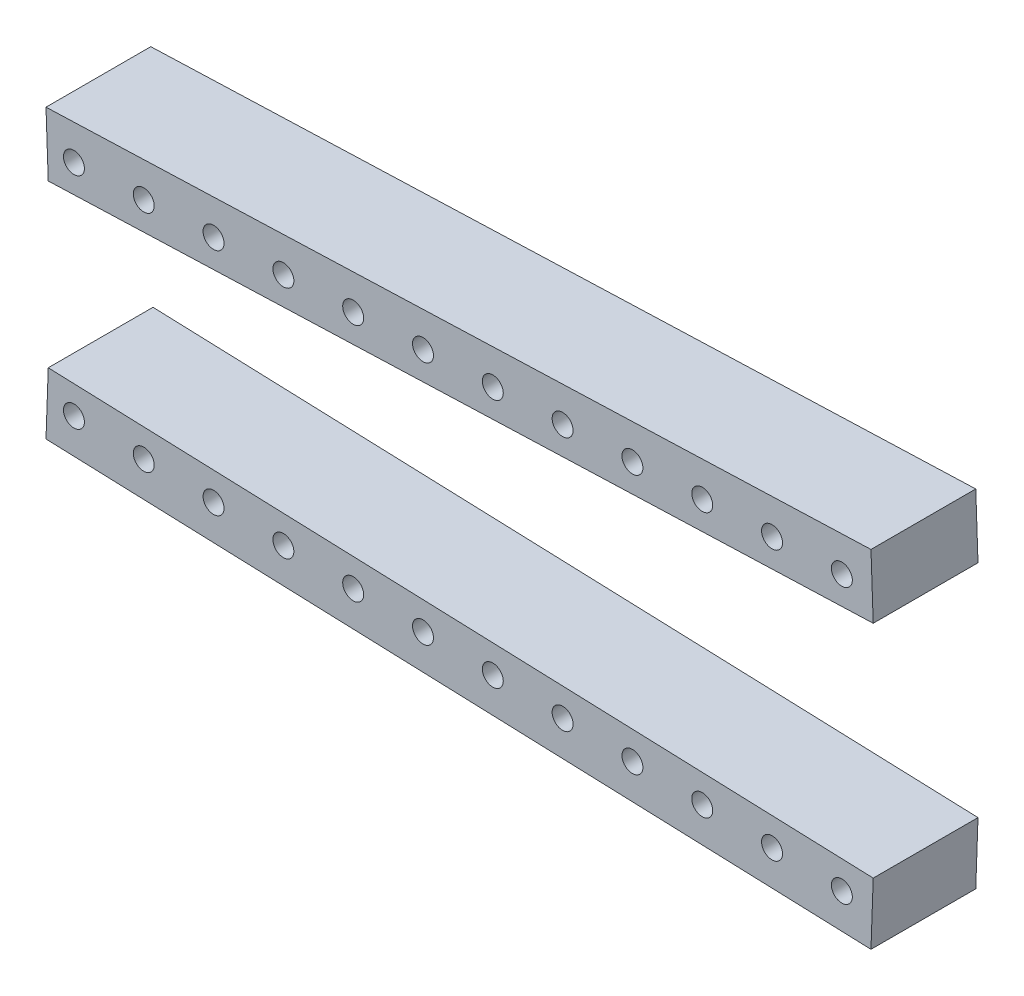
ISO-10303-21;
HEADER;
FILE_DESCRIPTION(('STEP AP214'),'2;1');
FILE_NAME('part.step','',(''),(''),'','','');
FILE_SCHEMA(('AUTOMOTIVE_DESIGN { 1 0 10303 214 1 1 1 1 }'));
ENDSEC;
DATA;
#1=APPLICATION_CONTEXT('core data for automotive mechanical design processes');
#2=APPLICATION_PROTOCOL_DEFINITION('international standard','automotive_design',2000,#1);
#3=PRODUCT_CONTEXT('',#1,'mechanical');
#4=PRODUCT('Part','Part','',(#3));
#5=PRODUCT_RELATED_PRODUCT_CATEGORY('part','',(#4));
#6=PRODUCT_DEFINITION_FORMATION('','',#4);
#7=PRODUCT_DEFINITION_CONTEXT('part definition',#1,'design');
#8=PRODUCT_DEFINITION('design','',#6,#7);
#9=PRODUCT_DEFINITION_SHAPE('','',#8);
#10=(LENGTH_UNIT() NAMED_UNIT(*) SI_UNIT(.MILLI.,.METRE.));
#11=(NAMED_UNIT(*) PLANE_ANGLE_UNIT() SI_UNIT($,.RADIAN.));
#12=(NAMED_UNIT(*) SI_UNIT($,.STERADIAN.) SOLID_ANGLE_UNIT());
#13=UNCERTAINTY_MEASURE_WITH_UNIT(LENGTH_MEASURE(1.E-05),#10,'distance_accuracy_value','');
#14=(GEOMETRIC_REPRESENTATION_CONTEXT(3) GLOBAL_UNCERTAINTY_ASSIGNED_CONTEXT((#13)) GLOBAL_UNIT_ASSIGNED_CONTEXT((#10,
#11,#12)) REPRESENTATION_CONTEXT('',''));
#15=CARTESIAN_POINT('',(0.,0.,0.));
#16=DIRECTION('',(0.,0.,1.));
#17=DIRECTION('',(1.,0.,0.));
#18=AXIS2_PLACEMENT_3D('',#15,#16,#17);
#19=CARTESIAN_POINT('',(-0.713375796178345,-19.9745222929936,-5.));
#20=DIRECTION('',(0.0356915305124125,0.99936285434755,0.));
#21=DIRECTION('',(-0.99936285434755,0.0356915305124125,0.));
#22=AXIS2_PLACEMENT_3D('',#19,#20,#21);
#23=PLANE('',#22);
#24=DIRECTION('',(0.,0.,1.));
#25=VECTOR('',#24,1.);
#26=CARTESIAN_POINT('',(15.9876544347127,-20.5709876583826,0.));
#27=LINE('',#26,#25);
#28=CARTESIAN_POINT('',(15.9876544347127,-20.5709876583826,-10.));
#29=VERTEX_POINT('',#28);
#30=CARTESIAN_POINT('',(15.9876544347127,-20.5709876583826,5.));
#31=VERTEX_POINT('',#30);
#32=EDGE_CURVE('E172',#29,#31,#27,.T.);
#33=ORIENTED_EDGE('',*,*,#32,.F.);
#34=DIRECTION('',(-0.99936285434755,0.0356915305124126,0.));
#35=VECTOR('',#34,1.);
#36=CARTESIAN_POINT('',(134.085070339558,-24.7887525121271,-10.));
#37=LINE('',#36,#35);
#38=CARTESIAN_POINT('',(134.085070339558,-24.7887525121271,-10.));
#39=VERTEX_POINT('',#38);
#40=EDGE_CURVE('E182',#39,#29,#37,.T.);
#41=ORIENTED_EDGE('',*,*,#40,.F.);
#42=DIRECTION('',(0.,0.,1.));
#43=VECTOR('',#42,1.);
#44=CARTESIAN_POINT('',(134.085070339558,-24.7887525121271,0.));
#45=LINE('',#44,#43);
#46=CARTESIAN_POINT('',(134.085070339558,-24.7887525121271,5.));
#47=VERTEX_POINT('',#46);
#48=EDGE_CURVE('E186',#39,#47,#45,.T.);
#49=ORIENTED_EDGE('',*,*,#48,.T.);
#50=DIRECTION('',(-0.99936285434755,0.0356915305124125,0.));
#51=VECTOR('',#50,1.);
#52=CARTESIAN_POINT('',(-0.713375796178345,-19.9745222929936,5.));
#53=LINE('',#52,#51);
#54=EDGE_CURVE('E189',#47,#31,#53,.T.);
#55=ORIENTED_EDGE('',*,*,#54,.T.);
#56=EDGE_LOOP('',(#33,#41,#49,#55));
#57=FACE_BOUND('',#56,.T.);
#58=ADVANCED_FACE('F124',(#57),#23,.F.);
#59=CARTESIAN_POINT('',(0.,0.,5.));
#60=DIRECTION('',(0.,0.,1.));
#61=DIRECTION('',(1.,0.,0.));
#62=AXIS2_PLACEMENT_3D('',#59,#60,#61);
#63=PLANE('',#62);
#64=DIRECTION('',(-0.0356915305124131,-0.99936285434755,0.));
#65=VECTOR('',#64,1.);
#66=CARTESIAN_POINT('',(134.798446135736,-4.81423021913351,5.));
#67=LINE('',#66,#65);
#68=CARTESIAN_POINT('',(134.406294114169,-15.7944868229991,5.));
#69=VERTEX_POINT('',#68);
#70=EDGE_CURVE('E128',#69,#47,#67,.T.);
#71=ORIENTED_EDGE('',*,*,#70,.F.);
#72=DIRECTION('',(-0.99936285434755,0.0356915305124125,0.));
#73=VECTOR('',#72,1.);
#74=CARTESIAN_POINT('',(-0.392152021566632,-10.9802566038657,5.));
#75=LINE('',#74,#73);
#76=CARTESIAN_POINT('',(16.3088782093244,-11.5767219692547,5.));
#77=VERTEX_POINT('',#76);
#78=EDGE_CURVE('E194',#69,#77,#75,.T.);
#79=ORIENTED_EDGE('',*,*,#78,.T.);
#80=DIRECTION('',(-0.0356915305124146,-0.99936285434755,0.));
#81=VECTOR('',#80,1.);
#82=CARTESIAN_POINT('',(16.7010302308911,-0.596465365389002,5.));
#83=LINE('',#82,#81);
#84=EDGE_CURVE('E167',#77,#31,#83,.T.);
#85=ORIENTED_EDGE('',*,*,#84,.T.);
#86=ORIENTED_EDGE('',*,*,#54,.F.);
#87=EDGE_LOOP('',(#71,#79,#85,#86));
#88=FACE_BOUND('',#87,.T.);
#89=CARTESIAN_POINT('',(119.923542521706,-19.2829836614895,5.));
#90=DIRECTION('',(0.,0.,1.));
#91=DIRECTION('',(1.,0.,0.));
#92=AXIS2_PLACEMENT_3D('',#89,#90,#91);
#93=CIRCLE('',#92,1.50000000000001);
#94=CARTESIAN_POINT('',(121.423542521706,-19.2829836614895,5.));
#95=VERTEX_POINT('',#94);
#96=EDGE_CURVE('E173',#95,#95,#93,.T.);
#97=ORIENTED_EDGE('',*,*,#96,.F.);
#98=EDGE_LOOP('',(#97));
#99=FACE_BOUND('',#98,.T.);
#100=CARTESIAN_POINT('',(109.92991397823,-18.9260683563654,5.));
#101=DIRECTION('',(0.,0.,1.));
#102=DIRECTION('',(1.,0.,0.));
#103=AXIS2_PLACEMENT_3D('',#100,#101,#102);
#104=CIRCLE('',#103,1.50000000000001);
#105=CARTESIAN_POINT('',(111.42991397823,-18.9260683563654,5.));
#106=VERTEX_POINT('',#105);
#107=EDGE_CURVE('E222',#106,#106,#104,.T.);
#108=ORIENTED_EDGE('',*,*,#107,.F.);
#109=EDGE_LOOP('',(#108));
#110=FACE_BOUND('',#109,.T.);
#111=CARTESIAN_POINT('',(99.9362854347549,-18.5691530512413,5.));
#112=DIRECTION('',(0.,0.,1.));
#113=DIRECTION('',(1.,0.,0.));
#114=AXIS2_PLACEMENT_3D('',#111,#112,#113);
#115=CIRCLE('',#114,1.50000000000001);
#116=CARTESIAN_POINT('',(101.436285434755,-18.5691530512413,5.));
#117=VERTEX_POINT('',#116);
#118=EDGE_CURVE('E225',#117,#117,#115,.T.);
#119=ORIENTED_EDGE('',*,*,#118,.F.);
#120=EDGE_LOOP('',(#119));
#121=FACE_BOUND('',#120,.T.);
#122=CARTESIAN_POINT('',(79.9490283478039,-17.855322440993,5.));
#123=DIRECTION('',(0.,0.,1.));
#124=DIRECTION('',(1.,0.,0.));
#125=AXIS2_PLACEMENT_3D('',#122,#123,#124);
#126=CIRCLE('',#125,1.50000000000001);
#127=CARTESIAN_POINT('',(81.4490283478039,-17.855322440993,5.));
#128=VERTEX_POINT('',#127);
#129=EDGE_CURVE('E207',#128,#128,#126,.T.);
#130=ORIENTED_EDGE('',*,*,#129,.F.);
#131=EDGE_LOOP('',(#130));
#132=FACE_BOUND('',#131,.T.);
#133=CARTESIAN_POINT('',(39.9745141739019,-16.4276612204965,5.));
#134=DIRECTION('',(0.,0.,1.));
#135=DIRECTION('',(1.,0.,0.));
#136=AXIS2_PLACEMENT_3D('',#133,#134,#135);
#137=CIRCLE('',#136,1.5);
#138=CARTESIAN_POINT('',(41.4745141739019,-16.4276612204965,5.));
#139=VERTEX_POINT('',#138);
#140=EDGE_CURVE('E204',#139,#139,#137,.T.);
#141=ORIENTED_EDGE('',*,*,#140,.F.);
#142=EDGE_LOOP('',(#141));
#143=FACE_BOUND('',#142,.T.);
#144=CARTESIAN_POINT('',(29.9808856304264,-16.0707459153724,5.));
#145=DIRECTION('',(0.,0.,1.));
#146=DIRECTION('',(1.,0.,0.));
#147=AXIS2_PLACEMENT_3D('',#144,#145,#146);
#148=CIRCLE('',#147,1.5);
#149=CARTESIAN_POINT('',(31.4808856304264,-16.0707459153724,5.));
#150=VERTEX_POINT('',#149);
#151=EDGE_CURVE('E198',#150,#150,#148,.T.);
#152=ORIENTED_EDGE('',*,*,#151,.F.);
#153=EDGE_LOOP('',(#152));
#154=FACE_BOUND('',#153,.T.);
#155=CARTESIAN_POINT('',(19.9872570869509,-15.7138306102482,5.));
#156=DIRECTION('',(0.,0.,1.));
#157=DIRECTION('',(1.,0.,0.));
#158=AXIS2_PLACEMENT_3D('',#155,#156,#157);
#159=CIRCLE('',#158,1.5);
#160=CARTESIAN_POINT('',(21.4872570869509,-15.7138306102482,5.));
#161=VERTEX_POINT('',#160);
#162=EDGE_CURVE('E195',#161,#161,#159,.T.);
#163=ORIENTED_EDGE('',*,*,#162,.F.);
#164=EDGE_LOOP('',(#163));
#165=FACE_BOUND('',#164,.T.);
#166=CARTESIAN_POINT('',(129.917171065181,-19.6398989666136,5.));
#167=DIRECTION('',(0.,0.,1.));
#168=DIRECTION('',(1.,0.,0.));
#169=AXIS2_PLACEMENT_3D('',#166,#167,#168);
#170=CIRCLE('',#169,1.5);
#171=CARTESIAN_POINT('',(131.417171065181,-19.6398989666136,5.));
#172=VERTEX_POINT('',#171);
#173=EDGE_CURVE('E200',#172,#172,#170,.T.);
#174=ORIENTED_EDGE('',*,*,#173,.F.);
#175=EDGE_LOOP('',(#174));
#176=FACE_BOUND('',#175,.T.);
#177=CARTESIAN_POINT('',(49.9681427173774,-16.7845765256206,5.));
#178=DIRECTION('',(0.,0.,1.));
#179=DIRECTION('',(1.,0.,0.));
#180=AXIS2_PLACEMENT_3D('',#177,#178,#179);
#181=CIRCLE('',#180,1.5);
#182=CARTESIAN_POINT('',(51.4681427173774,-16.7845765256206,5.));
#183=VERTEX_POINT('',#182);
#184=EDGE_CURVE('E199',#183,#183,#181,.T.);
#185=ORIENTED_EDGE('',*,*,#184,.F.);
#186=EDGE_LOOP('',(#185));
#187=FACE_BOUND('',#186,.T.);
#188=CARTESIAN_POINT('',(59.9617712608529,-17.1414918307448,5.));
#189=DIRECTION('',(0.,0.,1.));
#190=DIRECTION('',(1.,0.,0.));
#191=AXIS2_PLACEMENT_3D('',#188,#189,#190);
#192=CIRCLE('',#191,1.5);
#193=CARTESIAN_POINT('',(61.4617712608529,-17.1414918307448,5.));
#194=VERTEX_POINT('',#193);
#195=EDGE_CURVE('E215',#194,#194,#192,.T.);
#196=ORIENTED_EDGE('',*,*,#195,.F.);
#197=EDGE_LOOP('',(#196));
#198=FACE_BOUND('',#197,.T.);
#199=CARTESIAN_POINT('',(69.9553998043284,-17.4984071358689,5.));
#200=DIRECTION('',(0.,0.,1.));
#201=DIRECTION('',(1.,0.,0.));
#202=AXIS2_PLACEMENT_3D('',#199,#200,#201);
#203=CIRCLE('',#202,1.50000000000001);
#204=CARTESIAN_POINT('',(71.4553998043284,-17.4984071358689,5.));
#205=VERTEX_POINT('',#204);
#206=EDGE_CURVE('E212',#205,#205,#203,.T.);
#207=ORIENTED_EDGE('',*,*,#206,.F.);
#208=EDGE_LOOP('',(#207));
#209=FACE_BOUND('',#208,.T.);
#210=CARTESIAN_POINT('',(89.9426568912794,-18.2122377461171,5.));
#211=DIRECTION('',(0.,0.,1.));
#212=DIRECTION('',(1.,0.,0.));
#213=AXIS2_PLACEMENT_3D('',#210,#211,#212);
#214=CIRCLE('',#213,1.50000000000001);
#215=CARTESIAN_POINT('',(91.4426568912794,-18.2122377461171,5.));
#216=VERTEX_POINT('',#215);
#217=EDGE_CURVE('E203',#216,#216,#214,.T.);
#218=ORIENTED_EDGE('',*,*,#217,.F.);
#219=EDGE_LOOP('',(#218));
#220=FACE_BOUND('',#219,.T.);
#221=ADVANCED_FACE('F126',(#88,#99,#110,#121,#132,#143,#154,#165,#176,#187,#198,#209,#220),#63,.T.);
#222=CARTESIAN_POINT('',(129.917171065181,-19.6398989666136,-5.));
#223=DIRECTION('',(0.,0.,1.));
#224=DIRECTION('',(1.,0.,0.));
#225=AXIS2_PLACEMENT_3D('',#222,#223,#224);
#226=CYLINDRICAL_SURFACE('',#225,1.5);
#227=ORIENTED_EDGE('',*,*,#173,.T.);
#228=EDGE_LOOP('',(#227));
#229=FACE_BOUND('',#228,.T.);
#230=CARTESIAN_POINT('',(129.917171065181,-19.6398989666136,-10.));
#231=DIRECTION('',(0.,0.,1.));
#232=DIRECTION('',(1.,0.,0.));
#233=AXIS2_PLACEMENT_3D('',#230,#231,#232);
#234=CIRCLE('',#233,1.5);
#235=CARTESIAN_POINT('',(131.417171065181,-19.6398989666136,-10.));
#236=VERTEX_POINT('',#235);
#237=EDGE_CURVE('E183',#236,#236,#234,.T.);
#238=ORIENTED_EDGE('',*,*,#237,.F.);
#239=EDGE_LOOP('',(#238));
#240=FACE_BOUND('',#239,.T.);
#241=ADVANCED_FACE('F253',(#229,#240),#226,.F.);
#242=CARTESIAN_POINT('',(89.9426568912794,-18.2122377461171,-5.));
#243=DIRECTION('',(0.,0.,1.));
#244=DIRECTION('',(1.,0.,0.));
#245=AXIS2_PLACEMENT_3D('',#242,#243,#244);
#246=CYLINDRICAL_SURFACE('',#245,1.50000000000001);
#247=ORIENTED_EDGE('',*,*,#217,.T.);
#248=EDGE_LOOP('',(#247));
#249=FACE_BOUND('',#248,.T.);
#250=CARTESIAN_POINT('',(89.9426568912794,-18.2122377461171,-10.));
#251=DIRECTION('',(0.,0.,1.));
#252=DIRECTION('',(1.,0.,0.));
#253=AXIS2_PLACEMENT_3D('',#250,#251,#252);
#254=CIRCLE('',#253,1.50000000000001);
#255=CARTESIAN_POINT('',(91.4426568912794,-18.2122377461171,-10.));
#256=VERTEX_POINT('',#255);
#257=EDGE_CURVE('E485',#256,#256,#254,.T.);
#258=ORIENTED_EDGE('',*,*,#257,.F.);
#259=EDGE_LOOP('',(#258));
#260=FACE_BOUND('',#259,.T.);
#261=ADVANCED_FACE('F262',(#249,#260),#246,.F.);
#262=CARTESIAN_POINT('',(69.9553998043284,-17.4984071358689,-5.));
#263=DIRECTION('',(0.,0.,1.));
#264=DIRECTION('',(1.,0.,0.));
#265=AXIS2_PLACEMENT_3D('',#262,#263,#264);
#266=CYLINDRICAL_SURFACE('',#265,1.50000000000001);
#267=ORIENTED_EDGE('',*,*,#206,.T.);
#268=EDGE_LOOP('',(#267));
#269=FACE_BOUND('',#268,.T.);
#270=CARTESIAN_POINT('',(69.9553998043284,-17.4984071358689,-10.));
#271=DIRECTION('',(0.,0.,1.));
#272=DIRECTION('',(1.,0.,0.));
#273=AXIS2_PLACEMENT_3D('',#270,#271,#272);
#274=CIRCLE('',#273,1.50000000000001);
#275=CARTESIAN_POINT('',(71.4553998043284,-17.4984071358689,-10.));
#276=VERTEX_POINT('',#275);
#277=EDGE_CURVE('E486',#276,#276,#274,.T.);
#278=ORIENTED_EDGE('',*,*,#277,.F.);
#279=EDGE_LOOP('',(#278));
#280=FACE_BOUND('',#279,.T.);
#281=ADVANCED_FACE('F274',(#269,#280),#266,.F.);
#282=CARTESIAN_POINT('',(59.9617712608529,-17.1414918307448,-5.));
#283=DIRECTION('',(0.,0.,1.));
#284=DIRECTION('',(1.,0.,0.));
#285=AXIS2_PLACEMENT_3D('',#282,#283,#284);
#286=CYLINDRICAL_SURFACE('',#285,1.5);
#287=ORIENTED_EDGE('',*,*,#195,.T.);
#288=EDGE_LOOP('',(#287));
#289=FACE_BOUND('',#288,.T.);
#290=CARTESIAN_POINT('',(59.9617712608529,-17.1414918307448,-10.));
#291=DIRECTION('',(0.,0.,1.));
#292=DIRECTION('',(1.,0.,0.));
#293=AXIS2_PLACEMENT_3D('',#290,#291,#292);
#294=CIRCLE('',#293,1.5);
#295=CARTESIAN_POINT('',(61.4617712608529,-17.1414918307448,-10.));
#296=VERTEX_POINT('',#295);
#297=EDGE_CURVE('E492',#296,#296,#294,.T.);
#298=ORIENTED_EDGE('',*,*,#297,.F.);
#299=EDGE_LOOP('',(#298));
#300=FACE_BOUND('',#299,.T.);
#301=ADVANCED_FACE('F278',(#289,#300),#286,.F.);
#302=CARTESIAN_POINT('',(49.9681427173774,-16.7845765256206,-5.));
#303=DIRECTION('',(0.,0.,1.));
#304=DIRECTION('',(1.,0.,0.));
#305=AXIS2_PLACEMENT_3D('',#302,#303,#304);
#306=CYLINDRICAL_SURFACE('',#305,1.5);
#307=ORIENTED_EDGE('',*,*,#184,.T.);
#308=EDGE_LOOP('',(#307));
#309=FACE_BOUND('',#308,.T.);
#310=CARTESIAN_POINT('',(49.9681427173774,-16.7845765256206,-10.));
#311=DIRECTION('',(0.,0.,1.));
#312=DIRECTION('',(1.,0.,0.));
#313=AXIS2_PLACEMENT_3D('',#310,#311,#312);
#314=CIRCLE('',#313,1.5);
#315=CARTESIAN_POINT('',(51.4681427173774,-16.7845765256206,-10.));
#316=VERTEX_POINT('',#315);
#317=EDGE_CURVE('E498',#316,#316,#314,.T.);
#318=ORIENTED_EDGE('',*,*,#317,.F.);
#319=EDGE_LOOP('',(#318));
#320=FACE_BOUND('',#319,.T.);
#321=ADVANCED_FACE('F259',(#309,#320),#306,.F.);
#322=CARTESIAN_POINT('',(19.9872570869509,-15.7138306102482,-5.));
#323=DIRECTION('',(0.,0.,1.));
#324=DIRECTION('',(1.,0.,0.));
#325=AXIS2_PLACEMENT_3D('',#322,#323,#324);
#326=CYLINDRICAL_SURFACE('',#325,1.5);
#327=ORIENTED_EDGE('',*,*,#162,.T.);
#328=EDGE_LOOP('',(#327));
#329=FACE_BOUND('',#328,.T.);
#330=CARTESIAN_POINT('',(19.9872570869509,-15.7138306102482,-10.));
#331=DIRECTION('',(0.,0.,1.));
#332=DIRECTION('',(1.,0.,0.));
#333=AXIS2_PLACEMENT_3D('',#330,#331,#332);
#334=CIRCLE('',#333,1.5);
#335=CARTESIAN_POINT('',(21.4872570869509,-15.7138306102482,-10.));
#336=VERTEX_POINT('',#335);
#337=EDGE_CURVE('E507',#336,#336,#334,.T.);
#338=ORIENTED_EDGE('',*,*,#337,.F.);
#339=EDGE_LOOP('',(#338));
#340=FACE_BOUND('',#339,.T.);
#341=ADVANCED_FACE('F255',(#329,#340),#326,.F.);
#342=CARTESIAN_POINT('',(29.9808856304264,-16.0707459153724,-5.));
#343=DIRECTION('',(0.,0.,1.));
#344=DIRECTION('',(1.,0.,0.));
#345=AXIS2_PLACEMENT_3D('',#342,#343,#344);
#346=CYLINDRICAL_SURFACE('',#345,1.5);
#347=ORIENTED_EDGE('',*,*,#151,.T.);
#348=EDGE_LOOP('',(#347));
#349=FACE_BOUND('',#348,.T.);
#350=CARTESIAN_POINT('',(29.9808856304264,-16.0707459153724,-10.));
#351=DIRECTION('',(0.,0.,1.));
#352=DIRECTION('',(1.,0.,0.));
#353=AXIS2_PLACEMENT_3D('',#350,#351,#352);
#354=CIRCLE('',#353,1.5);
#355=CARTESIAN_POINT('',(31.4808856304264,-16.0707459153724,-10.));
#356=VERTEX_POINT('',#355);
#357=EDGE_CURVE('E504',#356,#356,#354,.T.);
#358=ORIENTED_EDGE('',*,*,#357,.F.);
#359=EDGE_LOOP('',(#358));
#360=FACE_BOUND('',#359,.T.);
#361=ADVANCED_FACE('F258',(#349,#360),#346,.F.);
#362=CARTESIAN_POINT('',(39.9745141739019,-16.4276612204965,-5.));
#363=DIRECTION('',(0.,0.,1.));
#364=DIRECTION('',(1.,0.,0.));
#365=AXIS2_PLACEMENT_3D('',#362,#363,#364);
#366=CYLINDRICAL_SURFACE('',#365,1.5);
#367=ORIENTED_EDGE('',*,*,#140,.T.);
#368=EDGE_LOOP('',(#367));
#369=FACE_BOUND('',#368,.T.);
#370=CARTESIAN_POINT('',(39.9745141739019,-16.4276612204965,-10.));
#371=DIRECTION('',(0.,0.,1.));
#372=DIRECTION('',(1.,0.,0.));
#373=AXIS2_PLACEMENT_3D('',#370,#371,#372);
#374=CIRCLE('',#373,1.49999999999999);
#375=CARTESIAN_POINT('',(41.4745141739019,-16.4276612204965,-10.));
#376=VERTEX_POINT('',#375);
#377=EDGE_CURVE('E501',#376,#376,#374,.T.);
#378=ORIENTED_EDGE('',*,*,#377,.F.);
#379=EDGE_LOOP('',(#378));
#380=FACE_BOUND('',#379,.T.);
#381=ADVANCED_FACE('F264',(#369,#380),#366,.F.);
#382=CARTESIAN_POINT('',(79.9490283478039,-17.855322440993,-5.));
#383=DIRECTION('',(0.,0.,1.));
#384=DIRECTION('',(1.,0.,0.));
#385=AXIS2_PLACEMENT_3D('',#382,#383,#384);
#386=CYLINDRICAL_SURFACE('',#385,1.50000000000001);
#387=ORIENTED_EDGE('',*,*,#129,.T.);
#388=EDGE_LOOP('',(#387));
#389=FACE_BOUND('',#388,.T.);
#390=CARTESIAN_POINT('',(79.9490283478039,-17.855322440993,-10.));
#391=DIRECTION('',(0.,0.,1.));
#392=DIRECTION('',(1.,0.,0.));
#393=AXIS2_PLACEMENT_3D('',#390,#391,#392);
#394=CIRCLE('',#393,1.50000000000001);
#395=CARTESIAN_POINT('',(81.4490283478039,-17.855322440993,-10.));
#396=VERTEX_POINT('',#395);
#397=EDGE_CURVE('E483',#396,#396,#394,.T.);
#398=ORIENTED_EDGE('',*,*,#397,.F.);
#399=EDGE_LOOP('',(#398));
#400=FACE_BOUND('',#399,.T.);
#401=ADVANCED_FACE('F267',(#389,#400),#386,.F.);
#402=CARTESIAN_POINT('',(99.9362854347549,-18.5691530512413,-5.));
#403=DIRECTION('',(0.,0.,1.));
#404=DIRECTION('',(1.,0.,0.));
#405=AXIS2_PLACEMENT_3D('',#402,#403,#404);
#406=CYLINDRICAL_SURFACE('',#405,1.50000000000001);
#407=ORIENTED_EDGE('',*,*,#118,.T.);
#408=EDGE_LOOP('',(#407));
#409=FACE_BOUND('',#408,.T.);
#410=CARTESIAN_POINT('',(99.9362854347549,-18.5691530512413,-10.));
#411=DIRECTION('',(0.,0.,1.));
#412=DIRECTION('',(1.,0.,0.));
#413=AXIS2_PLACEMENT_3D('',#410,#411,#412);
#414=CIRCLE('',#413,1.50000000000001);
#415=CARTESIAN_POINT('',(101.436285434755,-18.5691530512413,-10.));
#416=VERTEX_POINT('',#415);
#417=EDGE_CURVE('E489',#416,#416,#414,.T.);
#418=ORIENTED_EDGE('',*,*,#417,.F.);
#419=EDGE_LOOP('',(#418));
#420=FACE_BOUND('',#419,.T.);
#421=ADVANCED_FACE('F293',(#409,#420),#406,.F.);
#422=CARTESIAN_POINT('',(109.92991397823,-18.9260683563654,-5.));
#423=DIRECTION('',(0.,0.,1.));
#424=DIRECTION('',(1.,0.,0.));
#425=AXIS2_PLACEMENT_3D('',#422,#423,#424);
#426=CYLINDRICAL_SURFACE('',#425,1.50000000000001);
#427=ORIENTED_EDGE('',*,*,#107,.T.);
#428=EDGE_LOOP('',(#427));
#429=FACE_BOUND('',#428,.T.);
#430=CARTESIAN_POINT('',(109.92991397823,-18.9260683563654,-10.));
#431=DIRECTION('',(0.,0.,1.));
#432=DIRECTION('',(1.,0.,0.));
#433=AXIS2_PLACEMENT_3D('',#430,#431,#432);
#434=CIRCLE('',#433,1.50000000000001);
#435=CARTESIAN_POINT('',(111.42991397823,-18.9260683563654,-10.));
#436=VERTEX_POINT('',#435);
#437=EDGE_CURVE('E526',#436,#436,#434,.T.);
#438=ORIENTED_EDGE('',*,*,#437,.F.);
#439=EDGE_LOOP('',(#438));
#440=FACE_BOUND('',#439,.T.);
#441=ADVANCED_FACE('F289',(#429,#440),#426,.F.);
#442=CARTESIAN_POINT('',(119.923542521706,-19.2829836614895,-5.));
#443=DIRECTION('',(0.,0.,1.));
#444=DIRECTION('',(1.,0.,0.));
#445=AXIS2_PLACEMENT_3D('',#442,#443,#444);
#446=CYLINDRICAL_SURFACE('',#445,1.50000000000001);
#447=ORIENTED_EDGE('',*,*,#96,.T.);
#448=EDGE_LOOP('',(#447));
#449=FACE_BOUND('',#448,.T.);
#450=CARTESIAN_POINT('',(119.923542521706,-19.2829836614895,-10.));
#451=DIRECTION('',(0.,0.,1.));
#452=DIRECTION('',(1.,0.,0.));
#453=AXIS2_PLACEMENT_3D('',#450,#451,#452);
#454=CIRCLE('',#453,1.50000000000001);
#455=CARTESIAN_POINT('',(121.423542521706,-19.2829836614895,-10.));
#456=VERTEX_POINT('',#455);
#457=EDGE_CURVE('E529',#456,#456,#454,.T.);
#458=ORIENTED_EDGE('',*,*,#457,.F.);
#459=EDGE_LOOP('',(#458));
#460=FACE_BOUND('',#459,.T.);
#461=ADVANCED_FACE('F286',(#449,#460),#446,.F.);
#462=CARTESIAN_POINT('',(-0.392152021566632,-10.9802566038657,0.));
#463=DIRECTION('',(0.0356915305124125,0.99936285434755,0.));
#464=DIRECTION('',(-0.99936285434755,0.0356915305124125,0.));
#465=AXIS2_PLACEMENT_3D('',#462,#463,#464);
#466=PLANE('',#465);
#467=ORIENTED_EDGE('',*,*,#78,.F.);
#468=DIRECTION('',(0.,0.,1.));
#469=VECTOR('',#468,1.);
#470=CARTESIAN_POINT('',(134.406294114169,-15.7944868229991,0.));
#471=LINE('',#470,#469);
#472=CARTESIAN_POINT('',(134.406294114169,-15.7944868229991,-10.));
#473=VERTEX_POINT('',#472);
#474=EDGE_CURVE('E13',#473,#69,#471,.T.);
#475=ORIENTED_EDGE('',*,*,#474,.F.);
#476=DIRECTION('',(0.99936285434755,-0.0356915305124126,0.));
#477=VECTOR('',#476,1.);
#478=CARTESIAN_POINT('',(16.3088782093244,-11.5767219692547,-10.));
#479=LINE('',#478,#477);
#480=CARTESIAN_POINT('',(16.3088782093244,-11.5767219692547,-10.));
#481=VERTEX_POINT('',#480);
#482=EDGE_CURVE('E180',#481,#473,#479,.T.);
#483=ORIENTED_EDGE('',*,*,#482,.F.);
#484=DIRECTION('',(0.,0.,1.));
#485=VECTOR('',#484,1.);
#486=CARTESIAN_POINT('',(16.3088782093244,-11.5767219692547,0.));
#487=LINE('',#486,#485);
#488=EDGE_CURVE('E161',#481,#77,#487,.T.);
#489=ORIENTED_EDGE('',*,*,#488,.T.);
#490=EDGE_LOOP('',(#467,#475,#483,#489));
#491=FACE_BOUND('',#490,.T.);
#492=ADVANCED_FACE('F185',(#491),#466,.T.);
#493=CARTESIAN_POINT('',(16.7010302308911,-0.596465365389002,0.));
#494=DIRECTION('',(-0.999362854347549,0.0356915305124146,0.));
#495=DIRECTION('',(-0.0356915305124146,-0.99936285434755,0.));
#496=AXIS2_PLACEMENT_3D('',#493,#494,#495);
#497=PLANE('',#496);
#498=ORIENTED_EDGE('',*,*,#84,.F.);
#499=ORIENTED_EDGE('',*,*,#488,.F.);
#500=DIRECTION('',(0.0356915305124142,0.99936285434755,0.));
#501=VECTOR('',#500,1.);
#502=CARTESIAN_POINT('',(15.9876544347127,-20.5709876583826,-10.));
#503=LINE('',#502,#501);
#504=EDGE_CURVE('E165',#29,#481,#503,.T.);
#505=ORIENTED_EDGE('',*,*,#504,.F.);
#506=ORIENTED_EDGE('',*,*,#32,.T.);
#507=EDGE_LOOP('',(#498,#499,#505,#506));
#508=FACE_BOUND('',#507,.T.);
#509=ADVANCED_FACE('F163',(#508),#497,.T.);
#510=CARTESIAN_POINT('',(134.798446135736,-4.81423021913351,0.));
#511=DIRECTION('',(-0.99936285434755,0.0356915305124131,0.));
#512=DIRECTION('',(-0.0356915305124131,-0.99936285434755,0.));
#513=AXIS2_PLACEMENT_3D('',#510,#511,#512);
#514=PLANE('',#513);
#515=ORIENTED_EDGE('',*,*,#70,.T.);
#516=ORIENTED_EDGE('',*,*,#48,.F.);
#517=DIRECTION('',(-0.03569153051241,-0.99936285434755,0.));
#518=VECTOR('',#517,1.);
#519=CARTESIAN_POINT('',(134.406294114169,-15.7944868229991,-10.));
#520=LINE('',#519,#518);
#521=EDGE_CURVE('E187',#473,#39,#520,.T.);
#522=ORIENTED_EDGE('',*,*,#521,.F.);
#523=ORIENTED_EDGE('',*,*,#474,.T.);
#524=EDGE_LOOP('',(#515,#516,#522,#523));
#525=FACE_BOUND('',#524,.T.);
#526=ADVANCED_FACE('F236',(#525),#514,.F.);
#527=CARTESIAN_POINT('',(0.,0.,-10.));
#528=DIRECTION('',(0.,0.,-1.));
#529=DIRECTION('',(-1.,0.,0.));
#530=AXIS2_PLACEMENT_3D('',#527,#528,#529);
#531=PLANE('',#530);
#532=ORIENTED_EDGE('',*,*,#237,.T.);
#533=EDGE_LOOP('',(#532));
#534=FACE_BOUND('',#533,.T.);
#535=ORIENTED_EDGE('',*,*,#457,.T.);
#536=EDGE_LOOP('',(#535));
#537=FACE_BOUND('',#536,.T.);
#538=ORIENTED_EDGE('',*,*,#437,.T.);
#539=EDGE_LOOP('',(#538));
#540=FACE_BOUND('',#539,.T.);
#541=ORIENTED_EDGE('',*,*,#417,.T.);
#542=EDGE_LOOP('',(#541));
#543=FACE_BOUND('',#542,.T.);
#544=ORIENTED_EDGE('',*,*,#257,.T.);
#545=EDGE_LOOP('',(#544));
#546=FACE_BOUND('',#545,.T.);
#547=ORIENTED_EDGE('',*,*,#397,.T.);
#548=EDGE_LOOP('',(#547));
#549=FACE_BOUND('',#548,.T.);
#550=ORIENTED_EDGE('',*,*,#277,.T.);
#551=EDGE_LOOP('',(#550));
#552=FACE_BOUND('',#551,.T.);
#553=ORIENTED_EDGE('',*,*,#297,.T.);
#554=EDGE_LOOP('',(#553));
#555=FACE_BOUND('',#554,.T.);
#556=ORIENTED_EDGE('',*,*,#317,.T.);
#557=EDGE_LOOP('',(#556));
#558=FACE_BOUND('',#557,.T.);
#559=ORIENTED_EDGE('',*,*,#377,.T.);
#560=EDGE_LOOP('',(#559));
#561=FACE_BOUND('',#560,.T.);
#562=ORIENTED_EDGE('',*,*,#357,.T.);
#563=EDGE_LOOP('',(#562));
#564=FACE_BOUND('',#563,.T.);
#565=ORIENTED_EDGE('',*,*,#337,.T.);
#566=EDGE_LOOP('',(#565));
#567=FACE_BOUND('',#566,.T.);
#568=ORIENTED_EDGE('',*,*,#482,.T.);
#569=ORIENTED_EDGE('',*,*,#521,.T.);
#570=ORIENTED_EDGE('',*,*,#40,.T.);
#571=ORIENTED_EDGE('',*,*,#504,.T.);
#572=EDGE_LOOP('',(#568,#569,#570,#571));
#573=FACE_BOUND('',#572,.T.);
#574=ADVANCED_FACE('F178',(#534,#537,#540,#543,#546,#549,#552,#555,#558,#561,#564,#567,#573),
#531,.T.);
#575=CLOSED_SHELL('',(#58,#221,#241,#261,#281,#301,#321,#341,#361,#381,#401,#421,#441,#461,#492,
#509,#526,#574));
#576=MANIFOLD_SOLID_BREP('B2',#575);
#577=CARTESIAN_POINT('',(129.917171065181,19.6398989666136,0.));
#578=DIRECTION('',(0.,0.,1.));
#579=DIRECTION('',(1.,0.,0.));
#580=AXIS2_PLACEMENT_3D('',#577,#578,#579);
#581=CYLINDRICAL_SURFACE('',#580,1.5);
#582=CARTESIAN_POINT('',(129.917171065181,19.6398989666136,5.));
#583=DIRECTION('',(0.,0.,1.));
#584=DIRECTION('',(1.,0.,0.));
#585=AXIS2_PLACEMENT_3D('',#582,#583,#584);
#586=CIRCLE('',#585,1.5);
#587=CARTESIAN_POINT('',(131.417171065181,19.6398989666136,5.));
#588=VERTEX_POINT('',#587);
#589=EDGE_CURVE('E666',#588,#588,#586,.T.);
#590=ORIENTED_EDGE('',*,*,#589,.T.);
#591=EDGE_LOOP('',(#590));
#592=FACE_BOUND('',#591,.T.);
#593=CARTESIAN_POINT('',(129.917171065181,19.6398989666136,-10.));
#594=DIRECTION('',(0.,0.,1.));
#595=DIRECTION('',(1.,0.,0.));
#596=AXIS2_PLACEMENT_3D('',#593,#594,#595);
#597=CIRCLE('',#596,1.5);
#598=CARTESIAN_POINT('',(131.417171065181,19.6398989666136,-10.));
#599=VERTEX_POINT('',#598);
#600=EDGE_CURVE('E649',#599,#599,#597,.T.);
#601=ORIENTED_EDGE('',*,*,#600,.F.);
#602=EDGE_LOOP('',(#601));
#603=FACE_BOUND('',#602,.T.);
#604=ADVANCED_FACE('F575',(#592,#603),#581,.F.);
#605=CARTESIAN_POINT('',(49.9681427173775,16.7845765256206,0.));
#606=DIRECTION('',(0.,0.,1.));
#607=DIRECTION('',(1.,0.,0.));
#608=AXIS2_PLACEMENT_3D('',#605,#606,#607);
#609=CYLINDRICAL_SURFACE('',#608,1.5);
#610=CARTESIAN_POINT('',(49.9681427173775,16.7845765256206,5.));
#611=DIRECTION('',(0.,0.,1.));
#612=DIRECTION('',(1.,0.,0.));
#613=AXIS2_PLACEMENT_3D('',#610,#611,#612);
#614=CIRCLE('',#613,1.5);
#615=CARTESIAN_POINT('',(51.4681427173775,16.7845765256206,5.));
#616=VERTEX_POINT('',#615);
#617=EDGE_CURVE('E584',#616,#616,#614,.T.);
#618=ORIENTED_EDGE('',*,*,#617,.T.);
#619=EDGE_LOOP('',(#618));
#620=FACE_BOUND('',#619,.T.);
#621=CARTESIAN_POINT('',(49.9681427173775,16.7845765256206,-10.));
#622=DIRECTION('',(0.,0.,1.));
#623=DIRECTION('',(1.,0.,0.));
#624=AXIS2_PLACEMENT_3D('',#621,#622,#623);
#625=CIRCLE('',#624,1.5);
#626=CARTESIAN_POINT('',(51.4681427173775,16.7845765256206,-10.));
#627=VERTEX_POINT('',#626);
#628=EDGE_CURVE('E998',#627,#627,#625,.T.);
#629=ORIENTED_EDGE('',*,*,#628,.F.);
#630=EDGE_LOOP('',(#629));
#631=FACE_BOUND('',#630,.T.);
#632=ADVANCED_FACE('F717',(#620,#631),#609,.F.);
#633=CARTESIAN_POINT('',(89.9426568912795,18.2122377461171,0.));
#634=DIRECTION('',(0.,0.,1.));
#635=DIRECTION('',(1.,0.,0.));
#636=AXIS2_PLACEMENT_3D('',#633,#634,#635);
#637=CYLINDRICAL_SURFACE('',#636,1.5);
#638=CARTESIAN_POINT('',(89.9426568912795,18.2122377461171,5.));
#639=DIRECTION('',(0.,0.,1.));
#640=DIRECTION('',(1.,0.,0.));
#641=AXIS2_PLACEMENT_3D('',#638,#639,#640);
#642=CIRCLE('',#641,1.5);
#643=CARTESIAN_POINT('',(91.4426568912795,18.2122377461171,5.));
#644=VERTEX_POINT('',#643);
#645=EDGE_CURVE('E684',#644,#644,#642,.T.);
#646=ORIENTED_EDGE('',*,*,#645,.T.);
#647=EDGE_LOOP('',(#646));
#648=FACE_BOUND('',#647,.T.);
#649=CARTESIAN_POINT('',(89.9426568912795,18.2122377461171,-10.));
#650=DIRECTION('',(0.,0.,1.));
#651=DIRECTION('',(1.,0.,0.));
#652=AXIS2_PLACEMENT_3D('',#649,#650,#651);
#653=CIRCLE('',#652,1.5);
#654=CARTESIAN_POINT('',(91.4426568912795,18.2122377461171,-10.));
#655=VERTEX_POINT('',#654);
#656=EDGE_CURVE('E1014',#655,#655,#653,.T.);
#657=ORIENTED_EDGE('',*,*,#656,.F.);
#658=EDGE_LOOP('',(#657));
#659=FACE_BOUND('',#658,.T.);
#660=ADVANCED_FACE('F766',(#648,#659),#637,.F.);
#661=CARTESIAN_POINT('',(79.949028347804,17.855322440993,0.));
#662=DIRECTION('',(0.,0.,1.));
#663=DIRECTION('',(1.,0.,0.));
#664=AXIS2_PLACEMENT_3D('',#661,#662,#663);
#665=CYLINDRICAL_SURFACE('',#664,1.5);
#666=CARTESIAN_POINT('',(79.949028347804,17.855322440993,5.));
#667=DIRECTION('',(0.,0.,1.));
#668=DIRECTION('',(1.,0.,0.));
#669=AXIS2_PLACEMENT_3D('',#666,#667,#668);
#670=CIRCLE('',#669,1.5);
#671=CARTESIAN_POINT('',(81.449028347804,17.855322440993,5.));
#672=VERTEX_POINT('',#671);
#673=EDGE_CURVE('E680',#672,#672,#670,.T.);
#674=ORIENTED_EDGE('',*,*,#673,.T.);
#675=EDGE_LOOP('',(#674));
#676=FACE_BOUND('',#675,.T.);
#677=CARTESIAN_POINT('',(79.949028347804,17.855322440993,-10.));
#678=DIRECTION('',(0.,0.,1.));
#679=DIRECTION('',(1.,0.,0.));
#680=AXIS2_PLACEMENT_3D('',#677,#678,#679);
#681=CIRCLE('',#680,1.50000000000001);
#682=CARTESIAN_POINT('',(81.449028347804,17.855322440993,-10.));
#683=VERTEX_POINT('',#682);
#684=EDGE_CURVE('E1010',#683,#683,#681,.T.);
#685=ORIENTED_EDGE('',*,*,#684,.F.);
#686=EDGE_LOOP('',(#685));
#687=FACE_BOUND('',#686,.T.);
#688=ADVANCED_FACE('F792',(#676,#687),#665,.F.);
#689=CARTESIAN_POINT('',(39.974514173902,16.4276612204965,0.));
#690=DIRECTION('',(0.,0.,1.));
#691=DIRECTION('',(1.,0.,0.));
#692=AXIS2_PLACEMENT_3D('',#689,#690,#691);
#693=CYLINDRICAL_SURFACE('',#692,1.5);
#694=CARTESIAN_POINT('',(39.974514173902,16.4276612204965,5.));
#695=DIRECTION('',(0.,0.,1.));
#696=DIRECTION('',(1.,0.,0.));
#697=AXIS2_PLACEMENT_3D('',#694,#695,#696);
#698=CIRCLE('',#697,1.5);
#699=CARTESIAN_POINT('',(41.474514173902,16.4276612204965,5.));
#700=VERTEX_POINT('',#699);
#701=EDGE_CURVE('E676',#700,#700,#698,.T.);
#702=ORIENTED_EDGE('',*,*,#701,.T.);
#703=EDGE_LOOP('',(#702));
#704=FACE_BOUND('',#703,.T.);
#705=CARTESIAN_POINT('',(39.974514173902,16.4276612204965,-10.));
#706=DIRECTION('',(0.,0.,1.));
#707=DIRECTION('',(1.,0.,0.));
#708=AXIS2_PLACEMENT_3D('',#705,#706,#707);
#709=CIRCLE('',#708,1.5);
#710=CARTESIAN_POINT('',(41.474514173902,16.4276612204965,-10.));
#711=VERTEX_POINT('',#710);
#712=EDGE_CURVE('E994',#711,#711,#709,.T.);
#713=ORIENTED_EDGE('',*,*,#712,.F.);
#714=EDGE_LOOP('',(#713));
#715=FACE_BOUND('',#714,.T.);
#716=ADVANCED_FACE('F796',(#704,#715),#693,.F.);
#717=CARTESIAN_POINT('',(29.9808856304265,16.0707459153724,0.));
#718=DIRECTION('',(0.,0.,1.));
#719=DIRECTION('',(1.,0.,0.));
#720=AXIS2_PLACEMENT_3D('',#717,#718,#719);
#721=CYLINDRICAL_SURFACE('',#720,1.5);
#722=CARTESIAN_POINT('',(29.9808856304265,16.0707459153724,5.));
#723=DIRECTION('',(0.,0.,1.));
#724=DIRECTION('',(1.,0.,0.));
#725=AXIS2_PLACEMENT_3D('',#722,#723,#724);
#726=CIRCLE('',#725,1.5);
#727=CARTESIAN_POINT('',(31.4808856304265,16.0707459153724,5.));
#728=VERTEX_POINT('',#727);
#729=EDGE_CURVE('E671',#728,#728,#726,.T.);
#730=ORIENTED_EDGE('',*,*,#729,.T.);
#731=EDGE_LOOP('',(#730));
#732=FACE_BOUND('',#731,.T.);
#733=CARTESIAN_POINT('',(29.9808856304265,16.0707459153724,-10.));
#734=DIRECTION('',(0.,0.,1.));
#735=DIRECTION('',(1.,0.,0.));
#736=AXIS2_PLACEMENT_3D('',#733,#734,#735);
#737=CIRCLE('',#736,1.5);
#738=CARTESIAN_POINT('',(31.4808856304265,16.0707459153724,-10.));
#739=VERTEX_POINT('',#738);
#740=EDGE_CURVE('E646',#739,#739,#737,.T.);
#741=ORIENTED_EDGE('',*,*,#740,.F.);
#742=EDGE_LOOP('',(#741));
#743=FACE_BOUND('',#742,.T.);
#744=ADVANCED_FACE('F782',(#732,#743),#721,.F.);
#745=CARTESIAN_POINT('',(19.987257086951,15.7138306102482,0.));
#746=DIRECTION('',(0.,0.,1.));
#747=DIRECTION('',(1.,0.,0.));
#748=AXIS2_PLACEMENT_3D('',#745,#746,#747);
#749=CYLINDRICAL_SURFACE('',#748,1.5);
#750=CARTESIAN_POINT('',(19.987257086951,15.7138306102482,5.));
#751=DIRECTION('',(0.,0.,1.));
#752=DIRECTION('',(1.,0.,0.));
#753=AXIS2_PLACEMENT_3D('',#750,#751,#752);
#754=CIRCLE('',#753,1.5);
#755=CARTESIAN_POINT('',(21.487257086951,15.7138306102482,5.));
#756=VERTEX_POINT('',#755);
#757=EDGE_CURVE('E675',#756,#756,#754,.T.);
#758=ORIENTED_EDGE('',*,*,#757,.T.);
#759=EDGE_LOOP('',(#758));
#760=FACE_BOUND('',#759,.T.);
#761=CARTESIAN_POINT('',(19.987257086951,15.7138306102482,-10.));
#762=DIRECTION('',(0.,0.,1.));
#763=DIRECTION('',(1.,0.,0.));
#764=AXIS2_PLACEMENT_3D('',#761,#762,#763);
#765=CIRCLE('',#764,1.5);
#766=CARTESIAN_POINT('',(21.487257086951,15.7138306102482,-10.));
#767=VERTEX_POINT('',#766);
#768=EDGE_CURVE('E642',#767,#767,#765,.T.);
#769=ORIENTED_EDGE('',*,*,#768,.F.);
#770=EDGE_LOOP('',(#769));
#771=FACE_BOUND('',#770,.T.);
#772=ADVANCED_FACE('F778',(#760,#771),#749,.F.);
#773=CARTESIAN_POINT('',(69.9553998043285,17.4984071358689,0.));
#774=DIRECTION('',(0.,0.,1.));
#775=DIRECTION('',(1.,0.,0.));
#776=AXIS2_PLACEMENT_3D('',#773,#774,#775);
#777=CYLINDRICAL_SURFACE('',#776,1.5);
#778=CARTESIAN_POINT('',(69.9553998043285,17.4984071358689,5.));
#779=DIRECTION('',(0.,0.,1.));
#780=DIRECTION('',(1.,0.,0.));
#781=AXIS2_PLACEMENT_3D('',#778,#779,#780);
#782=CIRCLE('',#781,1.5);
#783=CARTESIAN_POINT('',(71.4553998043285,17.4984071358689,5.));
#784=VERTEX_POINT('',#783);
#785=EDGE_CURVE('E693',#784,#784,#782,.T.);
#786=ORIENTED_EDGE('',*,*,#785,.T.);
#787=EDGE_LOOP('',(#786));
#788=FACE_BOUND('',#787,.T.);
#789=CARTESIAN_POINT('',(69.9553998043285,17.4984071358689,-10.));
#790=DIRECTION('',(0.,0.,1.));
#791=DIRECTION('',(1.,0.,0.));
#792=AXIS2_PLACEMENT_3D('',#789,#790,#791);
#793=CIRCLE('',#792,1.5);
#794=CARTESIAN_POINT('',(71.4553998043285,17.4984071358689,-10.));
#795=VERTEX_POINT('',#794);
#796=EDGE_CURVE('E1006',#795,#795,#793,.T.);
#797=ORIENTED_EDGE('',*,*,#796,.F.);
#798=EDGE_LOOP('',(#797));
#799=FACE_BOUND('',#798,.T.);
#800=ADVANCED_FACE('F781',(#788,#799),#777,.F.);
#801=CARTESIAN_POINT('',(59.961771260853,17.1414918307447,0.));
#802=DIRECTION('',(0.,0.,1.));
#803=DIRECTION('',(1.,0.,0.));
#804=AXIS2_PLACEMENT_3D('',#801,#802,#803);
#805=CYLINDRICAL_SURFACE('',#804,1.5);
#806=CARTESIAN_POINT('',(59.961771260853,17.1414918307447,5.));
#807=DIRECTION('',(0.,0.,1.));
#808=DIRECTION('',(1.,0.,0.));
#809=AXIS2_PLACEMENT_3D('',#806,#807,#808);
#810=CIRCLE('',#809,1.5);
#811=CARTESIAN_POINT('',(61.461771260853,17.1414918307447,5.));
#812=VERTEX_POINT('',#811);
#813=EDGE_CURVE('E689',#812,#812,#810,.T.);
#814=ORIENTED_EDGE('',*,*,#813,.T.);
#815=EDGE_LOOP('',(#814));
#816=FACE_BOUND('',#815,.T.);
#817=CARTESIAN_POINT('',(59.961771260853,17.1414918307447,-10.));
#818=DIRECTION('',(0.,0.,1.));
#819=DIRECTION('',(1.,0.,0.));
#820=AXIS2_PLACEMENT_3D('',#817,#818,#819);
#821=CIRCLE('',#820,1.5);
#822=CARTESIAN_POINT('',(61.461771260853,17.1414918307447,-10.));
#823=VERTEX_POINT('',#822);
#824=EDGE_CURVE('E1002',#823,#823,#821,.T.);
#825=ORIENTED_EDGE('',*,*,#824,.F.);
#826=EDGE_LOOP('',(#825));
#827=FACE_BOUND('',#826,.T.);
#828=ADVANCED_FACE('F776',(#816,#827),#805,.F.);
#829=CARTESIAN_POINT('',(99.936285434755,18.5691530512413,0.));
#830=DIRECTION('',(0.,0.,1.));
#831=DIRECTION('',(1.,0.,0.));
#832=AXIS2_PLACEMENT_3D('',#829,#830,#831);
#833=CYLINDRICAL_SURFACE('',#832,1.5);
#834=CARTESIAN_POINT('',(99.936285434755,18.5691530512413,5.));
#835=DIRECTION('',(0.,0.,1.));
#836=DIRECTION('',(1.,0.,0.));
#837=AXIS2_PLACEMENT_3D('',#834,#835,#836);
#838=CIRCLE('',#837,1.5);
#839=CARTESIAN_POINT('',(101.436285434755,18.5691530512413,5.));
#840=VERTEX_POINT('',#839);
#841=EDGE_CURVE('E688',#840,#840,#838,.T.);
#842=ORIENTED_EDGE('',*,*,#841,.T.);
#843=EDGE_LOOP('',(#842));
#844=FACE_BOUND('',#843,.T.);
#845=CARTESIAN_POINT('',(99.936285434755,18.5691530512413,-10.));
#846=DIRECTION('',(0.,0.,1.));
#847=DIRECTION('',(1.,0.,0.));
#848=AXIS2_PLACEMENT_3D('',#845,#846,#847);
#849=CIRCLE('',#848,1.5);
#850=CARTESIAN_POINT('',(101.436285434755,18.5691530512413,-10.));
#851=VERTEX_POINT('',#850);
#852=EDGE_CURVE('E1018',#851,#851,#849,.T.);
#853=ORIENTED_EDGE('',*,*,#852,.F.);
#854=EDGE_LOOP('',(#853));
#855=FACE_BOUND('',#854,.T.);
#856=ADVANCED_FACE('F772',(#844,#855),#833,.F.);
#857=CARTESIAN_POINT('',(109.92991397823,18.9260683563654,0.));
#858=DIRECTION('',(0.,0.,1.));
#859=DIRECTION('',(1.,0.,0.));
#860=AXIS2_PLACEMENT_3D('',#857,#858,#859);
#861=CYLINDRICAL_SURFACE('',#860,1.5);
#862=CARTESIAN_POINT('',(109.92991397823,18.9260683563654,5.));
#863=DIRECTION('',(0.,0.,1.));
#864=DIRECTION('',(1.,0.,0.));
#865=AXIS2_PLACEMENT_3D('',#862,#863,#864);
#866=CIRCLE('',#865,1.5);
#867=CARTESIAN_POINT('',(111.42991397823,18.9260683563654,5.));
#868=VERTEX_POINT('',#867);
#869=EDGE_CURVE('E703',#868,#868,#866,.T.);
#870=ORIENTED_EDGE('',*,*,#869,.T.);
#871=EDGE_LOOP('',(#870));
#872=FACE_BOUND('',#871,.T.);
#873=CARTESIAN_POINT('',(109.92991397823,18.9260683563654,-10.));
#874=DIRECTION('',(0.,0.,1.));
#875=DIRECTION('',(1.,0.,0.));
#876=AXIS2_PLACEMENT_3D('',#873,#874,#875);
#877=CIRCLE('',#876,1.5);
#878=CARTESIAN_POINT('',(111.42991397823,18.9260683563654,-10.));
#879=VERTEX_POINT('',#878);
#880=EDGE_CURVE('E1022',#879,#879,#877,.T.);
#881=ORIENTED_EDGE('',*,*,#880,.F.);
#882=EDGE_LOOP('',(#881));
#883=FACE_BOUND('',#882,.T.);
#884=ADVANCED_FACE('F754',(#872,#883),#861,.F.);
#885=CARTESIAN_POINT('',(119.923542521706,19.2829836614895,0.));
#886=DIRECTION('',(0.,0.,1.));
#887=DIRECTION('',(1.,0.,0.));
#888=AXIS2_PLACEMENT_3D('',#885,#886,#887);
#889=CYLINDRICAL_SURFACE('',#888,1.5);
#890=CARTESIAN_POINT('',(119.923542521706,19.2829836614895,5.));
#891=DIRECTION('',(0.,0.,1.));
#892=DIRECTION('',(1.,0.,0.));
#893=AXIS2_PLACEMENT_3D('',#890,#891,#892);
#894=CIRCLE('',#893,1.5);
#895=CARTESIAN_POINT('',(121.423542521706,19.2829836614895,5.));
#896=VERTEX_POINT('',#895);
#897=EDGE_CURVE('E707',#896,#896,#894,.T.);
#898=ORIENTED_EDGE('',*,*,#897,.T.);
#899=EDGE_LOOP('',(#898));
#900=FACE_BOUND('',#899,.T.);
#901=CARTESIAN_POINT('',(119.923542521706,19.2829836614895,-10.));
#902=DIRECTION('',(0.,0.,1.));
#903=DIRECTION('',(1.,0.,0.));
#904=AXIS2_PLACEMENT_3D('',#901,#902,#903);
#905=CIRCLE('',#904,1.5);
#906=CARTESIAN_POINT('',(121.423542521706,19.2829836614895,-10.));
#907=VERTEX_POINT('',#906);
#908=EDGE_CURVE('E1026',#907,#907,#905,.T.);
#909=ORIENTED_EDGE('',*,*,#908,.F.);
#910=EDGE_LOOP('',(#909));
#911=FACE_BOUND('',#910,.T.);
#912=ADVANCED_FACE('F748',(#900,#911),#889,.F.);
#913=CARTESIAN_POINT('',(16.701030230891,0.596465365388962,0.));
#914=DIRECTION('',(0.99936285434755,0.0356915305124123,0.));
#915=DIRECTION('',(-0.0356915305124123,0.99936285434755,0.));
#916=AXIS2_PLACEMENT_3D('',#913,#914,#915);
#917=PLANE('',#916);
#918=DIRECTION('',(-0.0356915305124123,0.99936285434755,0.));
#919=VECTOR('',#918,1.);
#920=CARTESIAN_POINT('',(16.701030230891,0.596465365388962,5.));
#921=LINE('',#920,#919);
#922=CARTESIAN_POINT('',(16.3088782093244,11.5767219692547,5.));
#923=VERTEX_POINT('',#922);
#924=CARTESIAN_POINT('',(15.9876544347127,20.5709876583826,5.));
#925=VERTEX_POINT('',#924);
#926=EDGE_CURVE('E660',#923,#925,#921,.T.);
#927=ORIENTED_EDGE('',*,*,#926,.T.);
#928=DIRECTION('',(0.,0.,1.));
#929=VECTOR('',#928,1.);
#930=CARTESIAN_POINT('',(15.9876544347127,20.5709876583826,0.));
#931=LINE('',#930,#929);
#932=CARTESIAN_POINT('',(15.9876544347127,20.5709876583826,-10.));
#933=VERTEX_POINT('',#932);
#934=EDGE_CURVE('E663',#933,#925,#931,.T.);
#935=ORIENTED_EDGE('',*,*,#934,.F.);
#936=DIRECTION('',(-0.0356915305124127,0.99936285434755,0.));
#937=VECTOR('',#936,1.);
#938=CARTESIAN_POINT('',(16.3088782093244,11.5767219692547,-10.));
#939=LINE('',#938,#937);
#940=CARTESIAN_POINT('',(16.3088782093244,11.5767219692547,-10.));
#941=VERTEX_POINT('',#940);
#942=EDGE_CURVE('E640',#941,#933,#939,.T.);
#943=ORIENTED_EDGE('',*,*,#942,.F.);
#944=DIRECTION('',(0.,0.,1.));
#945=VECTOR('',#944,1.);
#946=CARTESIAN_POINT('',(16.3088782093244,11.5767219692547,0.));
#947=LINE('',#946,#945);
#948=EDGE_CURVE('E596',#941,#923,#947,.T.);
#949=ORIENTED_EDGE('',*,*,#948,.T.);
#950=EDGE_LOOP('',(#927,#935,#943,#949));
#951=FACE_BOUND('',#950,.T.);
#952=ADVANCED_FACE('F746',(#951),#917,.F.);
#953=CARTESIAN_POINT('',(-0.713375796178345,19.9745222929936,-5.));
#954=DIRECTION('',(-0.0356915305124125,0.99936285434755,0.));
#955=DIRECTION('',(-0.99936285434755,-0.0356915305124125,0.));
#956=AXIS2_PLACEMENT_3D('',#953,#954,#955);
#957=PLANE('',#956);
#958=DIRECTION('',(-0.99936285434755,-0.0356915305124125,0.));
#959=VECTOR('',#958,1.);
#960=CARTESIAN_POINT('',(-0.713375796178345,19.9745222929936,5.));
#961=LINE('',#960,#959);
#962=CARTESIAN_POINT('',(134.085070339558,24.7887525121271,5.));
#963=VERTEX_POINT('',#962);
#964=EDGE_CURVE('E122',#963,#925,#961,.T.);
#965=ORIENTED_EDGE('',*,*,#964,.F.);
#966=DIRECTION('',(0.,0.,1.));
#967=VECTOR('',#966,1.);
#968=CARTESIAN_POINT('',(134.085070339558,24.7887525121271,0.));
#969=LINE('',#968,#967);
#970=CARTESIAN_POINT('',(134.085070339558,24.7887525121271,-10.));
#971=VERTEX_POINT('',#970);
#972=EDGE_CURVE('E616',#971,#963,#969,.T.);
#973=ORIENTED_EDGE('',*,*,#972,.F.);
#974=DIRECTION('',(0.99936285434755,0.0356915305124126,0.));
#975=VECTOR('',#974,1.);
#976=CARTESIAN_POINT('',(15.9876544347127,20.5709876583826,-10.));
#977=LINE('',#976,#975);
#978=EDGE_CURVE('E621',#933,#971,#977,.T.);
#979=ORIENTED_EDGE('',*,*,#978,.F.);
#980=ORIENTED_EDGE('',*,*,#934,.T.);
#981=EDGE_LOOP('',(#965,#973,#979,#980));
#982=FACE_BOUND('',#981,.T.);
#983=ADVANCED_FACE('F618',(#982),#957,.T.);
#984=CARTESIAN_POINT('',(-0.392152021566632,10.9802566038657,0.));
#985=DIRECTION('',(-0.0356915305124125,0.99936285434755,0.));
#986=DIRECTION('',(-0.99936285434755,-0.0356915305124125,0.));
#987=AXIS2_PLACEMENT_3D('',#984,#985,#986);
#988=PLANE('',#987);
#989=DIRECTION('',(-0.99936285434755,-0.0356915305124125,0.));
#990=VECTOR('',#989,1.);
#991=CARTESIAN_POINT('',(-0.392152021566632,10.9802566038657,5.));
#992=LINE('',#991,#990);
#993=CARTESIAN_POINT('',(134.406294114169,15.7944868229991,5.));
#994=VERTEX_POINT('',#993);
#995=EDGE_CURVE('E624',#994,#923,#992,.T.);
#996=ORIENTED_EDGE('',*,*,#995,.T.);
#997=ORIENTED_EDGE('',*,*,#948,.F.);
#998=DIRECTION('',(-0.99936285434755,-0.0356915305124126,0.));
#999=VECTOR('',#998,1.);
#1000=CARTESIAN_POINT('',(134.406294114169,15.7944868229991,-10.));
#1001=LINE('',#1000,#999);
#1002=CARTESIAN_POINT('',(134.406294114169,15.7944868229991,-10.));
#1003=VERTEX_POINT('',#1002);
#1004=EDGE_CURVE('E636',#1003,#941,#1001,.T.);
#1005=ORIENTED_EDGE('',*,*,#1004,.F.);
#1006=DIRECTION('',(0.,0.,1.));
#1007=VECTOR('',#1006,1.);
#1008=CARTESIAN_POINT('',(134.406294114169,15.7944868229991,0.));
#1009=LINE('',#1008,#1007);
#1010=EDGE_CURVE('E631',#1003,#994,#1009,.T.);
#1011=ORIENTED_EDGE('',*,*,#1010,.T.);
#1012=EDGE_LOOP('',(#996,#997,#1005,#1011));
#1013=FACE_BOUND('',#1012,.T.);
#1014=ADVANCED_FACE('F722',(#1013),#988,.F.);
#1015=CARTESIAN_POINT('',(0.,0.,5.));
#1016=DIRECTION('',(0.,0.,1.));
#1017=DIRECTION('',(1.,0.,0.));
#1018=AXIS2_PLACEMENT_3D('',#1015,#1016,#1017);
#1019=PLANE('',#1018);
#1020=ORIENTED_EDGE('',*,*,#617,.F.);
#1021=EDGE_LOOP('',(#1020));
#1022=FACE_BOUND('',#1021,.T.);
#1023=ORIENTED_EDGE('',*,*,#645,.F.);
#1024=EDGE_LOOP('',(#1023));
#1025=FACE_BOUND('',#1024,.T.);
#1026=ORIENTED_EDGE('',*,*,#673,.F.);
#1027=EDGE_LOOP('',(#1026));
#1028=FACE_BOUND('',#1027,.T.);
#1029=ORIENTED_EDGE('',*,*,#701,.F.);
#1030=EDGE_LOOP('',(#1029));
#1031=FACE_BOUND('',#1030,.T.);
#1032=ORIENTED_EDGE('',*,*,#729,.F.);
#1033=EDGE_LOOP('',(#1032));
#1034=FACE_BOUND('',#1033,.T.);
#1035=ORIENTED_EDGE('',*,*,#757,.F.);
#1036=EDGE_LOOP('',(#1035));
#1037=FACE_BOUND('',#1036,.T.);
#1038=ORIENTED_EDGE('',*,*,#785,.F.);
#1039=EDGE_LOOP('',(#1038));
#1040=FACE_BOUND('',#1039,.T.);
#1041=ORIENTED_EDGE('',*,*,#813,.F.);
#1042=EDGE_LOOP('',(#1041));
#1043=FACE_BOUND('',#1042,.T.);
#1044=ORIENTED_EDGE('',*,*,#841,.F.);
#1045=EDGE_LOOP('',(#1044));
#1046=FACE_BOUND('',#1045,.T.);
#1047=ORIENTED_EDGE('',*,*,#869,.F.);
#1048=EDGE_LOOP('',(#1047));
#1049=FACE_BOUND('',#1048,.T.);
#1050=ORIENTED_EDGE('',*,*,#897,.F.);
#1051=EDGE_LOOP('',(#1050));
#1052=FACE_BOUND('',#1051,.T.);
#1053=ORIENTED_EDGE('',*,*,#589,.F.);
#1054=EDGE_LOOP('',(#1053));
#1055=FACE_BOUND('',#1054,.T.);
#1056=ORIENTED_EDGE('',*,*,#995,.F.);
#1057=DIRECTION('',(-0.035691530512413,0.99936285434755,0.));
#1058=VECTOR('',#1057,1.);
#1059=CARTESIAN_POINT('',(134.798446135736,4.8142302191335,5.));
#1060=LINE('',#1059,#1058);
#1061=EDGE_CURVE('E625',#994,#963,#1060,.T.);
#1062=ORIENTED_EDGE('',*,*,#1061,.T.);
#1063=ORIENTED_EDGE('',*,*,#964,.T.);
#1064=ORIENTED_EDGE('',*,*,#926,.F.);
#1065=EDGE_LOOP('',(#1056,#1062,#1063,#1064));
#1066=FACE_BOUND('',#1065,.T.);
#1067=ADVANCED_FACE('F577',(#1022,#1025,#1028,#1031,#1034,#1037,#1040,#1043,#1046,#1049,#1052,
#1055,#1066),#1019,.T.);
#1068=CARTESIAN_POINT('',(134.798446135736,4.8142302191335,0.));
#1069=DIRECTION('',(0.99936285434755,0.035691530512413,0.));
#1070=DIRECTION('',(-0.035691530512413,0.99936285434755,0.));
#1071=AXIS2_PLACEMENT_3D('',#1068,#1069,#1070);
#1072=PLANE('',#1071);
#1073=ORIENTED_EDGE('',*,*,#1061,.F.);
#1074=ORIENTED_EDGE('',*,*,#1010,.F.);
#1075=DIRECTION('',(0.03569153051241,-0.99936285434755,0.));
#1076=VECTOR('',#1075,1.);
#1077=CARTESIAN_POINT('',(134.085070339558,24.7887525121271,-10.));
#1078=LINE('',#1077,#1076);
#1079=EDGE_CURVE('E628',#971,#1003,#1078,.T.);
#1080=ORIENTED_EDGE('',*,*,#1079,.F.);
#1081=ORIENTED_EDGE('',*,*,#972,.T.);
#1082=EDGE_LOOP('',(#1073,#1074,#1080,#1081));
#1083=FACE_BOUND('',#1082,.T.);
#1084=ADVANCED_FACE('F629',(#1083),#1072,.T.);
#1085=CARTESIAN_POINT('',(0.,0.,-10.));
#1086=DIRECTION('',(0.,0.,-1.));
#1087=DIRECTION('',(-1.,0.,0.));
#1088=AXIS2_PLACEMENT_3D('',#1085,#1086,#1087);
#1089=PLANE('',#1088);
#1090=ORIENTED_EDGE('',*,*,#768,.T.);
#1091=EDGE_LOOP('',(#1090));
#1092=FACE_BOUND('',#1091,.T.);
#1093=ORIENTED_EDGE('',*,*,#740,.T.);
#1094=EDGE_LOOP('',(#1093));
#1095=FACE_BOUND('',#1094,.T.);
#1096=ORIENTED_EDGE('',*,*,#712,.T.);
#1097=EDGE_LOOP('',(#1096));
#1098=FACE_BOUND('',#1097,.T.);
#1099=ORIENTED_EDGE('',*,*,#628,.T.);
#1100=EDGE_LOOP('',(#1099));
#1101=FACE_BOUND('',#1100,.T.);
#1102=ORIENTED_EDGE('',*,*,#824,.T.);
#1103=EDGE_LOOP('',(#1102));
#1104=FACE_BOUND('',#1103,.T.);
#1105=ORIENTED_EDGE('',*,*,#796,.T.);
#1106=EDGE_LOOP('',(#1105));
#1107=FACE_BOUND('',#1106,.T.);
#1108=ORIENTED_EDGE('',*,*,#684,.T.);
#1109=EDGE_LOOP('',(#1108));
#1110=FACE_BOUND('',#1109,.T.);
#1111=ORIENTED_EDGE('',*,*,#656,.T.);
#1112=EDGE_LOOP('',(#1111));
#1113=FACE_BOUND('',#1112,.T.);
#1114=ORIENTED_EDGE('',*,*,#852,.T.);
#1115=EDGE_LOOP('',(#1114));
#1116=FACE_BOUND('',#1115,.T.);
#1117=ORIENTED_EDGE('',*,*,#880,.T.);
#1118=EDGE_LOOP('',(#1117));
#1119=FACE_BOUND('',#1118,.T.);
#1120=ORIENTED_EDGE('',*,*,#908,.T.);
#1121=EDGE_LOOP('',(#1120));
#1122=FACE_BOUND('',#1121,.T.);
#1123=ORIENTED_EDGE('',*,*,#600,.T.);
#1124=EDGE_LOOP('',(#1123));
#1125=FACE_BOUND('',#1124,.T.);
#1126=ORIENTED_EDGE('',*,*,#978,.T.);
#1127=ORIENTED_EDGE('',*,*,#1079,.T.);
#1128=ORIENTED_EDGE('',*,*,#1004,.T.);
#1129=ORIENTED_EDGE('',*,*,#942,.T.);
#1130=EDGE_LOOP('',(#1126,#1127,#1128,#1129));
#1131=FACE_BOUND('',#1130,.T.);
#1132=ADVANCED_FACE('F639',(#1092,#1095,#1098,#1101,#1104,#1107,#1110,#1113,#1116,#1119,#1122,
#1125,#1131),#1089,.T.);
#1133=CLOSED_SHELL('',(#604,#632,#660,#688,#716,#744,#772,#800,#828,#856,#884,#912,#952,#983,
#1014,#1067,#1084,#1132));
#1134=MANIFOLD_SOLID_BREP('B7',#1133);
#1135=ADVANCED_BREP_SHAPE_REPRESENTATION('',(#18,#576,#1134),#14);
#1136=SHAPE_DEFINITION_REPRESENTATION(#9,#1135);
ENDSEC;
END-ISO-10303-21;
